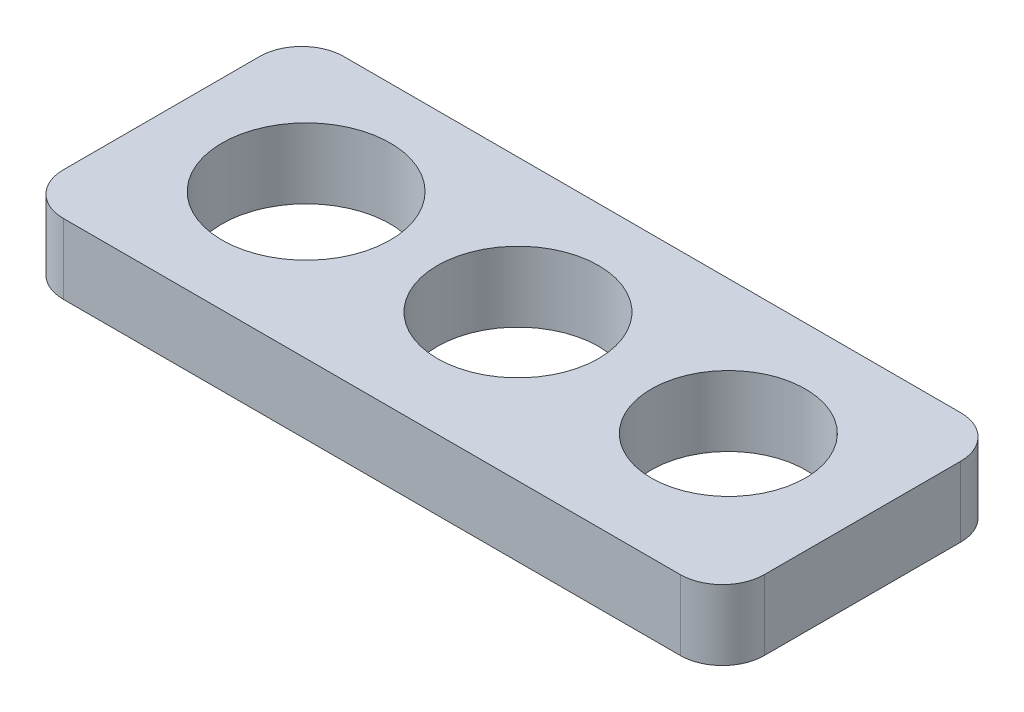
ISO-10303-21;
HEADER;
FILE_DESCRIPTION(('STEP AP214'),'2;1');
FILE_NAME('part.step','',(''),(''),'','','');
FILE_SCHEMA(('AUTOMOTIVE_DESIGN { 1 0 10303 214 1 1 1 1 }'));
ENDSEC;
DATA;
#1=APPLICATION_CONTEXT('core data for automotive mechanical design processes');
#2=APPLICATION_PROTOCOL_DEFINITION('international standard','automotive_design',2000,#1);
#3=PRODUCT_CONTEXT('',#1,'mechanical');
#4=PRODUCT('Part','Part','',(#3));
#5=PRODUCT_RELATED_PRODUCT_CATEGORY('part','',(#4));
#6=PRODUCT_DEFINITION_FORMATION('','',#4);
#7=PRODUCT_DEFINITION_CONTEXT('part definition',#1,'design');
#8=PRODUCT_DEFINITION('design','',#6,#7);
#9=PRODUCT_DEFINITION_SHAPE('','',#8);
#10=(LENGTH_UNIT() NAMED_UNIT(*) SI_UNIT(.MILLI.,.METRE.));
#11=(NAMED_UNIT(*) PLANE_ANGLE_UNIT() SI_UNIT($,.RADIAN.));
#12=(NAMED_UNIT(*) SI_UNIT($,.STERADIAN.) SOLID_ANGLE_UNIT());
#13=UNCERTAINTY_MEASURE_WITH_UNIT(LENGTH_MEASURE(1.E-05),#10,'distance_accuracy_value','');
#14=(GEOMETRIC_REPRESENTATION_CONTEXT(3) GLOBAL_UNCERTAINTY_ASSIGNED_CONTEXT((#13)) GLOBAL_UNIT_ASSIGNED_CONTEXT((#10,
#11,#12)) REPRESENTATION_CONTEXT('',''));
#15=CARTESIAN_POINT('',(0.,0.,0.));
#16=DIRECTION('',(0.,0.,1.));
#17=DIRECTION('',(1.,0.,0.));
#18=AXIS2_PLACEMENT_3D('',#15,#16,#17);
#19=CARTESIAN_POINT('',(3.,5.,-3.));
#20=DIRECTION('',(0.,-1.,0.));
#21=DIRECTION('',(0.,0.,-1.));
#22=AXIS2_PLACEMENT_3D('',#19,#20,#21);
#23=CYLINDRICAL_SURFACE('',#22,3.);
#24=CARTESIAN_POINT('',(3.,0.,-3.));
#25=DIRECTION('',(0.,1.,0.));
#26=DIRECTION('',(0.,0.,-1.));
#27=AXIS2_PLACEMENT_3D('',#24,#25,#26);
#28=CIRCLE('',#27,3.);
#29=CARTESIAN_POINT('',(0.,0.,-3.00000000000002));
#30=VERTEX_POINT('',#29);
#31=CARTESIAN_POINT('',(3.00000000000002,0.,0.));
#32=VERTEX_POINT('',#31);
#33=EDGE_CURVE('E131',#30,#32,#28,.T.);
#34=ORIENTED_EDGE('',*,*,#33,.T.);
#35=DIRECTION('',(0.,-1.,0.));
#36=VECTOR('',#35,1.);
#37=CARTESIAN_POINT('',(3.00000000000002,5.,0.));
#38=LINE('',#37,#36);
#39=CARTESIAN_POINT('',(3.00000000000002,5.,0.));
#40=VERTEX_POINT('',#39);
#41=EDGE_CURVE('E11',#40,#32,#38,.T.);
#42=ORIENTED_EDGE('',*,*,#41,.F.);
#43=CARTESIAN_POINT('',(3.,5.,-3.));
#44=DIRECTION('',(0.,1.,0.));
#45=DIRECTION('',(0.,0.,-1.));
#46=AXIS2_PLACEMENT_3D('',#43,#44,#45);
#47=CIRCLE('',#46,3.);
#48=CARTESIAN_POINT('',(0.,5.,-3.00000000000002));
#49=VERTEX_POINT('',#48);
#50=EDGE_CURVE('E146',#49,#40,#47,.T.);
#51=ORIENTED_EDGE('',*,*,#50,.F.);
#52=DIRECTION('',(0.,-1.,0.));
#53=VECTOR('',#52,1.);
#54=CARTESIAN_POINT('',(0.,5.,-3.00000000000002));
#55=LINE('',#54,#53);
#56=EDGE_CURVE('E127',#49,#30,#55,.T.);
#57=ORIENTED_EDGE('',*,*,#56,.T.);
#58=EDGE_LOOP('',(#34,#42,#51,#57));
#59=FACE_BOUND('',#58,.T.);
#60=ADVANCED_FACE('F35',(#59),#23,.T.);
#61=CARTESIAN_POINT('',(3.00000000000002,5.,0.));
#62=DIRECTION('',(0.,0.,-1.));
#63=DIRECTION('',(-1.,0.,0.));
#64=AXIS2_PLACEMENT_3D('',#61,#62,#63);
#65=PLANE('',#64);
#66=DIRECTION('',(1.,0.,0.));
#67=VECTOR('',#66,1.);
#68=CARTESIAN_POINT('',(3.00000000000002,0.,0.));
#69=LINE('',#68,#67);
#70=CARTESIAN_POINT('',(47.,0.,0.));
#71=VERTEX_POINT('',#70);
#72=EDGE_CURVE('E134',#32,#71,#69,.T.);
#73=ORIENTED_EDGE('',*,*,#72,.T.);
#74=DIRECTION('',(0.,-1.,0.));
#75=VECTOR('',#74,1.);
#76=CARTESIAN_POINT('',(47.,5.,0.));
#77=LINE('',#76,#75);
#78=CARTESIAN_POINT('',(47.,5.,0.));
#79=VERTEX_POINT('',#78);
#80=EDGE_CURVE('E43',#79,#71,#77,.T.);
#81=ORIENTED_EDGE('',*,*,#80,.F.);
#82=DIRECTION('',(1.,0.,0.));
#83=VECTOR('',#82,1.);
#84=CARTESIAN_POINT('',(3.00000000000002,5.,0.));
#85=LINE('',#84,#83);
#86=EDGE_CURVE('E94',#40,#79,#85,.T.);
#87=ORIENTED_EDGE('',*,*,#86,.F.);
#88=ORIENTED_EDGE('',*,*,#41,.T.);
#89=EDGE_LOOP('',(#73,#81,#87,#88));
#90=FACE_BOUND('',#89,.T.);
#91=ADVANCED_FACE('F227',(#90),#65,.F.);
#92=CARTESIAN_POINT('',(47.,5.,-3.));
#93=DIRECTION('',(0.,-1.,0.));
#94=DIRECTION('',(0.,0.,-1.));
#95=AXIS2_PLACEMENT_3D('',#92,#93,#94);
#96=CYLINDRICAL_SURFACE('',#95,3.);
#97=CARTESIAN_POINT('',(47.,0.,-3.));
#98=DIRECTION('',(0.,1.,0.));
#99=DIRECTION('',(0.,0.,1.));
#100=AXIS2_PLACEMENT_3D('',#97,#98,#99);
#101=CIRCLE('',#100,3.);
#102=CARTESIAN_POINT('',(50.,0.,-3.00000000000002));
#103=VERTEX_POINT('',#102);
#104=EDGE_CURVE('E137',#71,#103,#101,.T.);
#105=ORIENTED_EDGE('',*,*,#104,.T.);
#106=DIRECTION('',(0.,-1.,0.));
#107=VECTOR('',#106,1.);
#108=CARTESIAN_POINT('',(50.,5.,-3.00000000000002));
#109=LINE('',#108,#107);
#110=CARTESIAN_POINT('',(50.,5.,-3.00000000000002));
#111=VERTEX_POINT('',#110);
#112=EDGE_CURVE('E153',#111,#103,#109,.T.);
#113=ORIENTED_EDGE('',*,*,#112,.F.);
#114=CARTESIAN_POINT('',(47.,5.,-3.));
#115=DIRECTION('',(0.,1.,0.));
#116=DIRECTION('',(0.,0.,1.));
#117=AXIS2_PLACEMENT_3D('',#114,#115,#116);
#118=CIRCLE('',#117,3.);
#119=EDGE_CURVE('E161',#79,#111,#118,.T.);
#120=ORIENTED_EDGE('',*,*,#119,.F.);
#121=ORIENTED_EDGE('',*,*,#80,.T.);
#122=EDGE_LOOP('',(#105,#113,#120,#121));
#123=FACE_BOUND('',#122,.T.);
#124=ADVANCED_FACE('F159',(#123),#96,.T.);
#125=CARTESIAN_POINT('',(50.,5.,-3.00000000000002));
#126=DIRECTION('',(-1.,0.,0.));
#127=DIRECTION('',(0.,0.,1.));
#128=AXIS2_PLACEMENT_3D('',#125,#126,#127);
#129=PLANE('',#128);
#130=DIRECTION('',(0.,0.,-1.));
#131=VECTOR('',#130,1.);
#132=CARTESIAN_POINT('',(50.,0.,-3.00000000000002));
#133=LINE('',#132,#131);
#134=CARTESIAN_POINT('',(50.,0.,-17.));
#135=VERTEX_POINT('',#134);
#136=EDGE_CURVE('E139',#103,#135,#133,.T.);
#137=ORIENTED_EDGE('',*,*,#136,.T.);
#138=DIRECTION('',(0.,-1.,0.));
#139=VECTOR('',#138,1.);
#140=CARTESIAN_POINT('',(50.,5.,-17.));
#141=LINE('',#140,#139);
#142=CARTESIAN_POINT('',(50.,5.,-17.));
#143=VERTEX_POINT('',#142);
#144=EDGE_CURVE('E150',#143,#135,#141,.T.);
#145=ORIENTED_EDGE('',*,*,#144,.F.);
#146=DIRECTION('',(0.,0.,-1.));
#147=VECTOR('',#146,1.);
#148=CARTESIAN_POINT('',(50.,5.,-3.00000000000002));
#149=LINE('',#148,#147);
#150=EDGE_CURVE('E173',#111,#143,#149,.T.);
#151=ORIENTED_EDGE('',*,*,#150,.F.);
#152=ORIENTED_EDGE('',*,*,#112,.T.);
#153=EDGE_LOOP('',(#137,#145,#151,#152));
#154=FACE_BOUND('',#153,.T.);
#155=ADVANCED_FACE('F169',(#154),#129,.F.);
#156=CARTESIAN_POINT('',(47.,5.,-17.));
#157=DIRECTION('',(0.,-1.,0.));
#158=DIRECTION('',(0.,0.,-1.));
#159=AXIS2_PLACEMENT_3D('',#156,#157,#158);
#160=CYLINDRICAL_SURFACE('',#159,3.);
#161=CARTESIAN_POINT('',(47.,0.,-17.));
#162=DIRECTION('',(0.,1.,0.));
#163=DIRECTION('',(0.,0.,-1.));
#164=AXIS2_PLACEMENT_3D('',#161,#162,#163);
#165=CIRCLE('',#164,3.);
#166=CARTESIAN_POINT('',(47.,0.,-20.));
#167=VERTEX_POINT('',#166);
#168=EDGE_CURVE('E141',#135,#167,#165,.T.);
#169=ORIENTED_EDGE('',*,*,#168,.T.);
#170=DIRECTION('',(0.,-1.,0.));
#171=VECTOR('',#170,1.);
#172=CARTESIAN_POINT('',(47.,5.,-20.));
#173=LINE('',#172,#171);
#174=CARTESIAN_POINT('',(47.,5.,-20.));
#175=VERTEX_POINT('',#174);
#176=EDGE_CURVE('E122',#175,#167,#173,.T.);
#177=ORIENTED_EDGE('',*,*,#176,.F.);
#178=CARTESIAN_POINT('',(47.,5.,-17.));
#179=DIRECTION('',(0.,1.,0.));
#180=DIRECTION('',(0.,0.,-1.));
#181=AXIS2_PLACEMENT_3D('',#178,#179,#180);
#182=CIRCLE('',#181,3.);
#183=EDGE_CURVE('E113',#143,#175,#182,.T.);
#184=ORIENTED_EDGE('',*,*,#183,.F.);
#185=ORIENTED_EDGE('',*,*,#144,.T.);
#186=EDGE_LOOP('',(#169,#177,#184,#185));
#187=FACE_BOUND('',#186,.T.);
#188=ADVANCED_FACE('F172',(#187),#160,.T.);
#189=CARTESIAN_POINT('',(3.,5.,-20.));
#190=DIRECTION('',(0.,0.,1.));
#191=DIRECTION('',(1.,0.,0.));
#192=AXIS2_PLACEMENT_3D('',#189,#190,#191);
#193=PLANE('',#192);
#194=DIRECTION('',(-1.,0.,0.));
#195=VECTOR('',#194,1.);
#196=CARTESIAN_POINT('',(3.,0.,-20.));
#197=LINE('',#196,#195);
#198=CARTESIAN_POINT('',(3.,0.,-20.));
#199=VERTEX_POINT('',#198);
#200=EDGE_CURVE('E121',#167,#199,#197,.T.);
#201=ORIENTED_EDGE('',*,*,#200,.T.);
#202=DIRECTION('',(0.,-1.,0.));
#203=VECTOR('',#202,1.);
#204=CARTESIAN_POINT('',(3.,5.,-20.));
#205=LINE('',#204,#203);
#206=CARTESIAN_POINT('',(3.,5.,-20.));
#207=VERTEX_POINT('',#206);
#208=EDGE_CURVE('E118',#207,#199,#205,.T.);
#209=ORIENTED_EDGE('',*,*,#208,.F.);
#210=DIRECTION('',(-1.,0.,0.));
#211=VECTOR('',#210,1.);
#212=CARTESIAN_POINT('',(3.,5.,-20.));
#213=LINE('',#212,#211);
#214=EDGE_CURVE('E107',#175,#207,#213,.T.);
#215=ORIENTED_EDGE('',*,*,#214,.F.);
#216=ORIENTED_EDGE('',*,*,#176,.T.);
#217=EDGE_LOOP('',(#201,#209,#215,#216));
#218=FACE_BOUND('',#217,.T.);
#219=ADVANCED_FACE('F119',(#218),#193,.F.);
#220=CARTESIAN_POINT('',(3.,5.,-17.));
#221=DIRECTION('',(0.,-1.,0.));
#222=DIRECTION('',(0.,0.,-1.));
#223=AXIS2_PLACEMENT_3D('',#220,#221,#222);
#224=CYLINDRICAL_SURFACE('',#223,3.);
#225=CARTESIAN_POINT('',(3.,0.,-17.));
#226=DIRECTION('',(0.,1.,0.));
#227=DIRECTION('',(0.,0.,-1.));
#228=AXIS2_PLACEMENT_3D('',#225,#226,#227);
#229=CIRCLE('',#228,3.);
#230=CARTESIAN_POINT('',(0.,0.,-17.));
#231=VERTEX_POINT('',#230);
#232=EDGE_CURVE('E80',#199,#231,#229,.T.);
#233=ORIENTED_EDGE('',*,*,#232,.T.);
#234=DIRECTION('',(0.,-1.,0.));
#235=VECTOR('',#234,1.);
#236=CARTESIAN_POINT('',(0.,5.,-17.));
#237=LINE('',#236,#235);
#238=CARTESIAN_POINT('',(0.,5.,-17.));
#239=VERTEX_POINT('',#238);
#240=EDGE_CURVE('E123',#239,#231,#237,.T.);
#241=ORIENTED_EDGE('',*,*,#240,.F.);
#242=CARTESIAN_POINT('',(3.,5.,-17.));
#243=DIRECTION('',(0.,1.,0.));
#244=DIRECTION('',(0.,0.,-1.));
#245=AXIS2_PLACEMENT_3D('',#242,#243,#244);
#246=CIRCLE('',#245,3.);
#247=EDGE_CURVE('E111',#207,#239,#246,.T.);
#248=ORIENTED_EDGE('',*,*,#247,.F.);
#249=ORIENTED_EDGE('',*,*,#208,.T.);
#250=EDGE_LOOP('',(#233,#241,#248,#249));
#251=FACE_BOUND('',#250,.T.);
#252=ADVANCED_FACE('F125',(#251),#224,.T.);
#253=CARTESIAN_POINT('',(0.,5.,-3.00000000000002));
#254=DIRECTION('',(1.,0.,0.));
#255=DIRECTION('',(0.,0.,-1.));
#256=AXIS2_PLACEMENT_3D('',#253,#254,#255);
#257=PLANE('',#256);
#258=DIRECTION('',(0.,0.,1.));
#259=VECTOR('',#258,1.);
#260=CARTESIAN_POINT('',(0.,0.,-3.00000000000002));
#261=LINE('',#260,#259);
#262=EDGE_CURVE('E86',#231,#30,#261,.T.);
#263=ORIENTED_EDGE('',*,*,#262,.T.);
#264=ORIENTED_EDGE('',*,*,#56,.F.);
#265=DIRECTION('',(0.,0.,1.));
#266=VECTOR('',#265,1.);
#267=CARTESIAN_POINT('',(0.,5.,-3.00000000000002));
#268=LINE('',#267,#266);
#269=EDGE_CURVE('E51',#239,#49,#268,.T.);
#270=ORIENTED_EDGE('',*,*,#269,.F.);
#271=ORIENTED_EDGE('',*,*,#240,.T.);
#272=EDGE_LOOP('',(#263,#264,#270,#271));
#273=FACE_BOUND('',#272,.T.);
#274=ADVANCED_FACE('F208',(#273),#257,.F.);
#275=CARTESIAN_POINT('',(3.,5.,-3.));
#276=DIRECTION('',(0.,-1.,0.));
#277=DIRECTION('',(0.,0.,-1.));
#278=AXIS2_PLACEMENT_3D('',#275,#276,#277);
#279=PLANE('',#278);
#280=CARTESIAN_POINT('',(40.,5.,-10.4290671733966));
#281=DIRECTION('',(0.,1.,0.));
#282=DIRECTION('',(0.,0.,1.));
#283=AXIS2_PLACEMENT_3D('',#280,#281,#282);
#284=CIRCLE('',#283,5.5);
#285=CARTESIAN_POINT('',(40.,5.,-4.92906717339658));
#286=VERTEX_POINT('',#285);
#287=EDGE_CURVE('E191',#286,#286,#284,.T.);
#288=ORIENTED_EDGE('',*,*,#287,.F.);
#289=EDGE_LOOP('',(#288));
#290=FACE_BOUND('',#289,.T.);
#291=CARTESIAN_POINT('',(24.9963177560359,5.,-10.4290671733966));
#292=DIRECTION('',(0.,1.,0.));
#293=DIRECTION('',(0.,0.,1.));
#294=AXIS2_PLACEMENT_3D('',#291,#292,#293);
#295=CIRCLE('',#294,5.75);
#296=CARTESIAN_POINT('',(24.9963177560359,5.,-4.67906717339657));
#297=VERTEX_POINT('',#296);
#298=EDGE_CURVE('E185',#297,#297,#295,.T.);
#299=ORIENTED_EDGE('',*,*,#298,.F.);
#300=EDGE_LOOP('',(#299));
#301=FACE_BOUND('',#300,.T.);
#302=CARTESIAN_POINT('',(10.,5.,-10.316927665921));
#303=DIRECTION('',(0.,1.,0.));
#304=DIRECTION('',(0.,0.,1.));
#305=AXIS2_PLACEMENT_3D('',#302,#303,#304);
#306=CIRCLE('',#305,6.);
#307=CARTESIAN_POINT('',(10.,5.,-4.31692766592097));
#308=VERTEX_POINT('',#307);
#309=EDGE_CURVE('E179',#308,#308,#306,.T.);
#310=ORIENTED_EDGE('',*,*,#309,.F.);
#311=EDGE_LOOP('',(#310));
#312=FACE_BOUND('',#311,.T.);
#313=ORIENTED_EDGE('',*,*,#50,.T.);
#314=ORIENTED_EDGE('',*,*,#86,.T.);
#315=ORIENTED_EDGE('',*,*,#119,.T.);
#316=ORIENTED_EDGE('',*,*,#150,.T.);
#317=ORIENTED_EDGE('',*,*,#183,.T.);
#318=ORIENTED_EDGE('',*,*,#214,.T.);
#319=ORIENTED_EDGE('',*,*,#247,.T.);
#320=ORIENTED_EDGE('',*,*,#269,.T.);
#321=EDGE_LOOP('',(#313,#314,#315,#316,#317,#318,#319,#320));
#322=FACE_BOUND('',#321,.T.);
#323=ADVANCED_FACE('F109',(#290,#301,#312,#322),#279,.F.);
#324=CARTESIAN_POINT('',(3.,0.,-3.));
#325=DIRECTION('',(0.,-1.,0.));
#326=DIRECTION('',(0.,0.,-1.));
#327=AXIS2_PLACEMENT_3D('',#324,#325,#326);
#328=PLANE('',#327);
#329=CARTESIAN_POINT('',(40.,0.,-10.4290671733966));
#330=DIRECTION('',(0.,1.,0.));
#331=DIRECTION('',(0.,0.,1.));
#332=AXIS2_PLACEMENT_3D('',#329,#330,#331);
#333=CIRCLE('',#332,5.5);
#334=CARTESIAN_POINT('',(40.,0.,-4.92906717339658));
#335=VERTEX_POINT('',#334);
#336=EDGE_CURVE('E188',#335,#335,#333,.T.);
#337=ORIENTED_EDGE('',*,*,#336,.T.);
#338=EDGE_LOOP('',(#337));
#339=FACE_BOUND('',#338,.T.);
#340=CARTESIAN_POINT('',(24.9963177560359,0.,-10.4290671733966));
#341=DIRECTION('',(0.,1.,0.));
#342=DIRECTION('',(0.,0.,1.));
#343=AXIS2_PLACEMENT_3D('',#340,#341,#342);
#344=CIRCLE('',#343,5.75);
#345=CARTESIAN_POINT('',(24.9963177560359,0.,-4.67906717339657));
#346=VERTEX_POINT('',#345);
#347=EDGE_CURVE('E182',#346,#346,#344,.T.);
#348=ORIENTED_EDGE('',*,*,#347,.T.);
#349=EDGE_LOOP('',(#348));
#350=FACE_BOUND('',#349,.T.);
#351=CARTESIAN_POINT('',(10.,0.,-10.316927665921));
#352=DIRECTION('',(0.,1.,0.));
#353=DIRECTION('',(0.,0.,1.));
#354=AXIS2_PLACEMENT_3D('',#351,#352,#353);
#355=CIRCLE('',#354,6.);
#356=CARTESIAN_POINT('',(10.,0.,-4.31692766592097));
#357=VERTEX_POINT('',#356);
#358=EDGE_CURVE('E135',#357,#357,#355,.T.);
#359=ORIENTED_EDGE('',*,*,#358,.T.);
#360=EDGE_LOOP('',(#359));
#361=FACE_BOUND('',#360,.T.);
#362=ORIENTED_EDGE('',*,*,#33,.F.);
#363=ORIENTED_EDGE('',*,*,#262,.F.);
#364=ORIENTED_EDGE('',*,*,#232,.F.);
#365=ORIENTED_EDGE('',*,*,#200,.F.);
#366=ORIENTED_EDGE('',*,*,#168,.F.);
#367=ORIENTED_EDGE('',*,*,#136,.F.);
#368=ORIENTED_EDGE('',*,*,#104,.F.);
#369=ORIENTED_EDGE('',*,*,#72,.F.);
#370=EDGE_LOOP('',(#362,#363,#364,#365,#366,#367,#368,#369));
#371=FACE_BOUND('',#370,.T.);
#372=ADVANCED_FACE('F165',(#339,#350,#361,#371),#328,.T.);
#373=CARTESIAN_POINT('',(10.,0.,-10.316927665921));
#374=DIRECTION('',(0.,1.,0.));
#375=DIRECTION('',(0.,0.,1.));
#376=AXIS2_PLACEMENT_3D('',#373,#374,#375);
#377=CYLINDRICAL_SURFACE('',#376,6.);
#378=ORIENTED_EDGE('',*,*,#358,.F.);
#379=EDGE_LOOP('',(#378));
#380=FACE_BOUND('',#379,.T.);
#381=ORIENTED_EDGE('',*,*,#309,.T.);
#382=EDGE_LOOP('',(#381));
#383=FACE_BOUND('',#382,.T.);
#384=ADVANCED_FACE('F214',(#380,#383),#377,.F.);
#385=CARTESIAN_POINT('',(24.9963177560359,0.,-10.4290671733966));
#386=DIRECTION('',(0.,1.,0.));
#387=DIRECTION('',(0.,0.,1.));
#388=AXIS2_PLACEMENT_3D('',#385,#386,#387);
#389=CYLINDRICAL_SURFACE('',#388,5.75);
#390=ORIENTED_EDGE('',*,*,#347,.F.);
#391=EDGE_LOOP('',(#390));
#392=FACE_BOUND('',#391,.T.);
#393=ORIENTED_EDGE('',*,*,#298,.T.);
#394=EDGE_LOOP('',(#393));
#395=FACE_BOUND('',#394,.T.);
#396=ADVANCED_FACE('F202',(#392,#395),#389,.F.);
#397=CARTESIAN_POINT('',(40.,0.,-10.4290671733966));
#398=DIRECTION('',(0.,1.,0.));
#399=DIRECTION('',(0.,0.,1.));
#400=AXIS2_PLACEMENT_3D('',#397,#398,#399);
#401=CYLINDRICAL_SURFACE('',#400,5.5);
#402=ORIENTED_EDGE('',*,*,#336,.F.);
#403=EDGE_LOOP('',(#402));
#404=FACE_BOUND('',#403,.T.);
#405=ORIENTED_EDGE('',*,*,#287,.T.);
#406=EDGE_LOOP('',(#405));
#407=FACE_BOUND('',#406,.T.);
#408=ADVANCED_FACE('F199',(#404,#407),#401,.F.);
#409=CLOSED_SHELL('',(#60,#91,#124,#155,#188,#219,#252,#274,#323,#372,#384,#396,#408));
#410=MANIFOLD_SOLID_BREP('B2',#409);
#411=ADVANCED_BREP_SHAPE_REPRESENTATION('',(#18,#410),#14);
#412=SHAPE_DEFINITION_REPRESENTATION(#9,#411);
ENDSEC;
END-ISO-10303-21;
